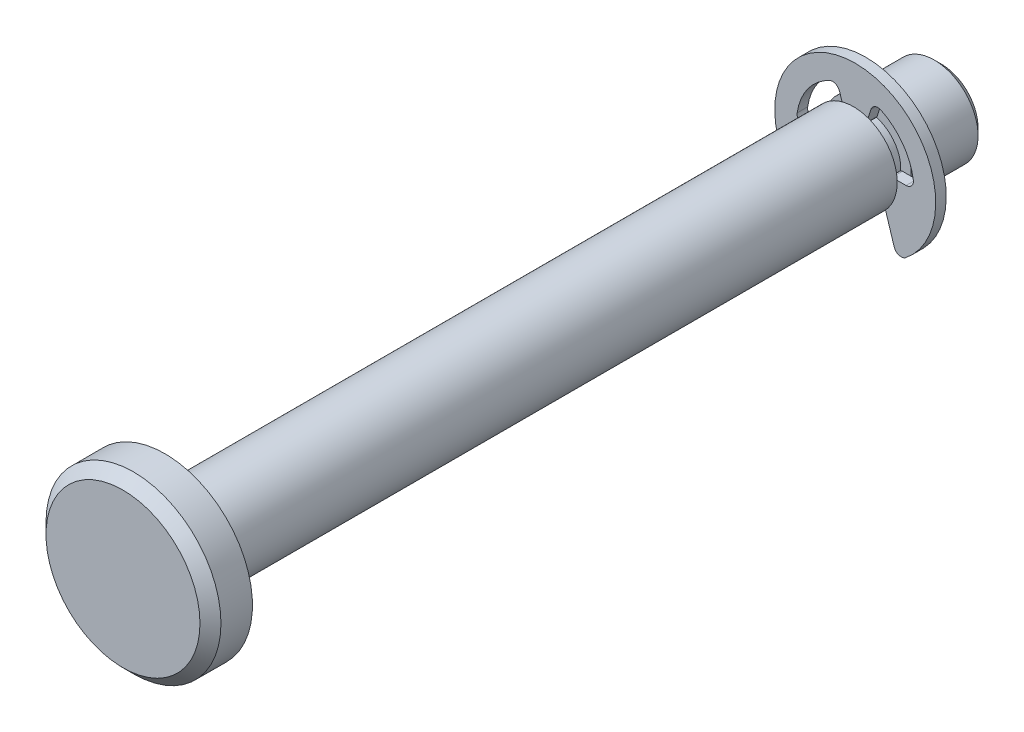
ISO-10303-21;
HEADER;
FILE_DESCRIPTION(('STEP AP214'),'2;1');
FILE_NAME('part.step','',(''),(''),'','','');
FILE_SCHEMA(('AUTOMOTIVE_DESIGN { 1 0 10303 214 1 1 1 1 }'));
ENDSEC;
DATA;
#1=APPLICATION_CONTEXT('core data for automotive mechanical design processes');
#2=APPLICATION_PROTOCOL_DEFINITION('international standard','automotive_design',2000,#1);
#3=PRODUCT_CONTEXT('',#1,'mechanical');
#4=PRODUCT('Part','Part','',(#3));
#5=PRODUCT_RELATED_PRODUCT_CATEGORY('part','',(#4));
#6=PRODUCT_DEFINITION_FORMATION('','',#4);
#7=PRODUCT_DEFINITION_CONTEXT('part definition',#1,'design');
#8=PRODUCT_DEFINITION('design','',#6,#7);
#9=PRODUCT_DEFINITION_SHAPE('','',#8);
#10=(LENGTH_UNIT() NAMED_UNIT(*) SI_UNIT(.MILLI.,.METRE.));
#11=(NAMED_UNIT(*) PLANE_ANGLE_UNIT() SI_UNIT($,.RADIAN.));
#12=(NAMED_UNIT(*) SI_UNIT($,.STERADIAN.) SOLID_ANGLE_UNIT());
#13=UNCERTAINTY_MEASURE_WITH_UNIT(LENGTH_MEASURE(1.E-05),#10,'distance_accuracy_value','');
#14=(GEOMETRIC_REPRESENTATION_CONTEXT(3) GLOBAL_UNCERTAINTY_ASSIGNED_CONTEXT((#13)) GLOBAL_UNIT_ASSIGNED_CONTEXT((#10,
#11,#12)) REPRESENTATION_CONTEXT('',''));
#15=CARTESIAN_POINT('',(0.,0.,0.));
#16=DIRECTION('',(0.,0.,1.));
#17=DIRECTION('',(1.,0.,0.));
#18=AXIS2_PLACEMENT_3D('',#15,#16,#17);
#19=CARTESIAN_POINT('',(1.11230004178683,-0.746985033010048,-13.8496));
#20=DIRECTION('',(0.,0.,1.));
#21=DIRECTION('',(1.,0.,0.));
#22=AXIS2_PLACEMENT_3D('',#19,#20,#21);
#23=CYLINDRICAL_SURFACE('',#22,0.13335);
#24=CARTESIAN_POINT('',(1.11230004178683,-0.746985033010048,-11.1064));
#25=DIRECTION('',(0.,0.,-1.));
#26=DIRECTION('',(0.,1.,0.));
#27=AXIS2_PLACEMENT_3D('',#24,#25,#26);
#28=CIRCLE('',#27,0.13335);
#29=CARTESIAN_POINT('',(0.98512188640455,-0.787084151373943,-11.1064));
#30=VERTEX_POINT('',#29);
#31=CARTESIAN_POINT('',(1.00159719402605,-0.672640551051702,-11.1064));
#32=VERTEX_POINT('',#31);
#33=EDGE_CURVE('P0_E463',#30,#32,#28,.T.);
#34=ORIENTED_EDGE('',*,*,#33,.F.);
#35=DIRECTION('',(0.,0.,-1.));
#36=VECTOR('',#35,1.);
#37=CARTESIAN_POINT('',(0.98512188640455,-0.787084151373942,-13.8496));
#38=LINE('',#37,#36);
#39=CARTESIAN_POINT('',(0.98512188640455,-0.787084151373942,-10.7254));
#40=VERTEX_POINT('',#39);
#41=EDGE_CURVE('P0_E25',#40,#30,#38,.T.);
#42=ORIENTED_EDGE('',*,*,#41,.F.);
#43=CARTESIAN_POINT('',(1.11230004178683,-0.746985033010048,-10.7254));
#44=DIRECTION('',(0.,0.,1.));
#45=DIRECTION('',(0.,-1.,0.));
#46=AXIS2_PLACEMENT_3D('',#43,#44,#45);
#47=CIRCLE('',#46,0.13335);
#48=CARTESIAN_POINT('',(1.00159719402605,-0.672640551051702,-10.7254));
#49=VERTEX_POINT('',#48);
#50=EDGE_CURVE('P0_E373',#49,#40,#47,.T.);
#51=ORIENTED_EDGE('',*,*,#50,.F.);
#52=DIRECTION('',(0.,0.,1.));
#53=VECTOR('',#52,1.);
#54=CARTESIAN_POINT('',(1.00159719402605,-0.672640551051702,-13.8496));
#55=LINE('',#54,#53);
#56=EDGE_CURVE('P0_E422',#32,#49,#55,.T.);
#57=ORIENTED_EDGE('',*,*,#56,.F.);
#58=EDGE_LOOP('',(#34,#42,#51,#57));
#59=FACE_BOUND('',#58,.T.);
#60=ADVANCED_FACE('P0_F17',(#59),#23,.T.);
#61=CARTESIAN_POINT('',(1.33319758475629,-0.133349999999999,-13.8496));
#62=DIRECTION('',(0.,0.,1.));
#63=DIRECTION('',(1.,0.,0.));
#64=AXIS2_PLACEMENT_3D('',#61,#62,#63);
#65=CYLINDRICAL_SURFACE('',#64,0.13335);
#66=CARTESIAN_POINT('',(1.33319758475629,-0.133349999999999,-11.1064));
#67=DIRECTION('',(0.,0.,-1.));
#68=DIRECTION('',(0.,1.,0.));
#69=AXIS2_PLACEMENT_3D('',#66,#67,#68);
#70=CIRCLE('',#69,0.13335);
#71=CARTESIAN_POINT('',(1.20050967347723,-0.120078199052131,-11.1064));
#72=VERTEX_POINT('',#71);
#73=CARTESIAN_POINT('',(1.33319758475629,0.,-11.1064));
#74=VERTEX_POINT('',#73);
#75=EDGE_CURVE('P0_E462',#72,#74,#70,.T.);
#76=ORIENTED_EDGE('',*,*,#75,.F.);
#77=DIRECTION('',(0.,0.,-1.));
#78=VECTOR('',#77,1.);
#79=CARTESIAN_POINT('',(1.20050967347723,-0.120078199052131,-13.8496));
#80=LINE('',#79,#78);
#81=CARTESIAN_POINT('',(1.20050967347723,-0.120078199052131,-10.7254));
#82=VERTEX_POINT('',#81);
#83=EDGE_CURVE('P0_E420',#82,#72,#80,.T.);
#84=ORIENTED_EDGE('',*,*,#83,.F.);
#85=CARTESIAN_POINT('',(1.33319758475629,-0.133349999999999,-10.7254));
#86=DIRECTION('',(0.,0.,1.));
#87=DIRECTION('',(0.,-1.,0.));
#88=AXIS2_PLACEMENT_3D('',#85,#86,#87);
#89=CIRCLE('',#88,0.13335);
#90=CARTESIAN_POINT('',(1.33319758475629,0.,-10.7254));
#91=VERTEX_POINT('',#90);
#92=EDGE_CURVE('P0_E365',#91,#82,#89,.T.);
#93=ORIENTED_EDGE('',*,*,#92,.F.);
#94=DIRECTION('',(0.,0.,1.));
#95=VECTOR('',#94,1.);
#96=CARTESIAN_POINT('',(1.33319758475629,0.,-13.8496));
#97=LINE('',#96,#95);
#98=EDGE_CURVE('P0_E368',#74,#91,#97,.T.);
#99=ORIENTED_EDGE('',*,*,#98,.F.);
#100=EDGE_LOOP('',(#76,#84,#93,#99));
#101=FACE_BOUND('',#100,.T.);
#102=ADVANCED_FACE('P0_F491',(#101),#65,.T.);
#103=CARTESIAN_POINT('',(0.285157324101359,1.30915366669133,-13.8496));
#104=DIRECTION('',(0.,0.,1.));
#105=DIRECTION('',(1.,0.,0.));
#106=AXIS2_PLACEMENT_3D('',#103,#104,#105);
#107=CYLINDRICAL_SURFACE('',#106,0.13335);
#108=CARTESIAN_POINT('',(0.285157324101359,1.30915366669133,-11.1064));
#109=DIRECTION('',(0.,0.,-1.));
#110=DIRECTION('',(0.,1.,0.));
#111=AXIS2_PLACEMENT_3D('',#108,#109,#110);
#112=CIRCLE('',#111,0.13335);
#113=CARTESIAN_POINT('',(0.411980710549319,1.26794625049143,-11.1064));
#114=VERTEX_POINT('',#113);
#115=CARTESIAN_POINT('',(0.256776737342456,1.17885875199693,-11.1064));
#116=VERTEX_POINT('',#115);
#117=EDGE_CURVE('P0_E270',#114,#116,#112,.T.);
#118=ORIENTED_EDGE('',*,*,#117,.F.);
#119=DIRECTION('',(0.,0.,-1.));
#120=VECTOR('',#119,1.);
#121=CARTESIAN_POINT('',(0.411980710549319,1.26794625049143,-13.8496));
#122=LINE('',#121,#120);
#123=CARTESIAN_POINT('',(0.411980710549319,1.26794625049143,-10.7254));
#124=VERTEX_POINT('',#123);
#125=EDGE_CURVE('P0_E378',#124,#114,#122,.T.);
#126=ORIENTED_EDGE('',*,*,#125,.F.);
#127=CARTESIAN_POINT('',(0.285157324101359,1.30915366669133,-10.7254));
#128=DIRECTION('',(0.,0.,1.));
#129=DIRECTION('',(0.,-1.,0.));
#130=AXIS2_PLACEMENT_3D('',#127,#128,#129);
#131=CIRCLE('',#130,0.13335);
#132=CARTESIAN_POINT('',(0.256776737342456,1.17885875199693,-10.7254));
#133=VERTEX_POINT('',#132);
#134=EDGE_CURVE('P0_E338',#133,#124,#131,.T.);
#135=ORIENTED_EDGE('',*,*,#134,.F.);
#136=DIRECTION('',(0.,0.,1.));
#137=VECTOR('',#136,1.);
#138=CARTESIAN_POINT('',(0.256776737342456,1.17885875199693,-13.8496));
#139=LINE('',#138,#137);
#140=EDGE_CURVE('P0_E381',#116,#133,#139,.T.);
#141=ORIENTED_EDGE('',*,*,#140,.F.);
#142=EDGE_LOOP('',(#118,#126,#135,#141));
#143=FACE_BOUND('',#142,.T.);
#144=ADVANCED_FACE('P0_F557',(#143),#107,.T.);
#145=CARTESIAN_POINT('',(-0.28515732410136,1.30915366669133,-13.8496));
#146=DIRECTION('',(0.,0.,1.));
#147=DIRECTION('',(1.,0.,0.));
#148=AXIS2_PLACEMENT_3D('',#145,#146,#147);
#149=CYLINDRICAL_SURFACE('',#148,0.13335);
#150=CARTESIAN_POINT('',(-0.28515732410136,1.30915366669133,-11.1064));
#151=DIRECTION('',(0.,0.,-1.));
#152=DIRECTION('',(0.,1.,0.));
#153=AXIS2_PLACEMENT_3D('',#150,#151,#152);
#154=CIRCLE('',#153,0.13335);
#155=CARTESIAN_POINT('',(-0.256776737342457,1.17885875199693,-11.1064));
#156=VERTEX_POINT('',#155);
#157=CARTESIAN_POINT('',(-0.411980710549319,1.26794625049143,-11.1064));
#158=VERTEX_POINT('',#157);
#159=EDGE_CURVE('P0_E239',#156,#158,#154,.T.);
#160=ORIENTED_EDGE('',*,*,#159,.F.);
#161=DIRECTION('',(0.,0.,-1.));
#162=VECTOR('',#161,1.);
#163=CARTESIAN_POINT('',(-0.256776737342457,1.17885875199693,-13.8496));
#164=LINE('',#163,#162);
#165=CARTESIAN_POINT('',(-0.256776737342457,1.17885875199693,-10.7254));
#166=VERTEX_POINT('',#165);
#167=EDGE_CURVE('P0_E396',#166,#156,#164,.T.);
#168=ORIENTED_EDGE('',*,*,#167,.F.);
#169=CARTESIAN_POINT('',(-0.28515732410136,1.30915366669133,-10.7254));
#170=DIRECTION('',(0.,0.,1.));
#171=DIRECTION('',(0.,-1.,0.));
#172=AXIS2_PLACEMENT_3D('',#169,#170,#171);
#173=CIRCLE('',#172,0.13335);
#174=CARTESIAN_POINT('',(-0.411980710549319,1.26794625049143,-10.7254));
#175=VERTEX_POINT('',#174);
#176=EDGE_CURVE('P0_E242',#175,#166,#173,.T.);
#177=ORIENTED_EDGE('',*,*,#176,.F.);
#178=DIRECTION('',(0.,0.,1.));
#179=VECTOR('',#178,1.);
#180=CARTESIAN_POINT('',(-0.411980710549319,1.26794625049143,-10.7254));
#181=LINE('',#180,#179);
#182=EDGE_CURVE('P0_E235',#158,#175,#181,.T.);
#183=ORIENTED_EDGE('',*,*,#182,.F.);
#184=EDGE_LOOP('',(#160,#168,#177,#183));
#185=FACE_BOUND('',#184,.T.);
#186=ADVANCED_FACE('P0_F237',(#185),#149,.T.);
#187=CARTESIAN_POINT('',(-1.33319758475629,-0.13335,-13.8496));
#188=DIRECTION('',(0.,0.,1.));
#189=DIRECTION('',(1.,0.,0.));
#190=AXIS2_PLACEMENT_3D('',#187,#188,#189);
#191=CYLINDRICAL_SURFACE('',#190,0.13335);
#192=CARTESIAN_POINT('',(-1.33319758475629,-0.13335,-11.1064));
#193=DIRECTION('',(0.,0.,-1.));
#194=DIRECTION('',(0.,1.,0.));
#195=AXIS2_PLACEMENT_3D('',#192,#193,#194);
#196=CIRCLE('',#195,0.13335);
#197=CARTESIAN_POINT('',(-1.33319758475629,0.,-11.1064));
#198=VERTEX_POINT('',#197);
#199=CARTESIAN_POINT('',(-1.20050967347722,-0.120078199052132,-11.1064));
#200=VERTEX_POINT('',#199);
#201=EDGE_CURVE('P0_E299',#198,#200,#196,.T.);
#202=ORIENTED_EDGE('',*,*,#201,.F.);
#203=DIRECTION('',(0.,0.,-1.));
#204=VECTOR('',#203,1.);
#205=CARTESIAN_POINT('',(-1.33319758475629,0.,-11.1064));
#206=LINE('',#205,#204);
#207=CARTESIAN_POINT('',(-1.33319758475629,0.,-10.7254));
#208=VERTEX_POINT('',#207);
#209=EDGE_CURVE('P0_E283',#208,#198,#206,.T.);
#210=ORIENTED_EDGE('',*,*,#209,.F.);
#211=CARTESIAN_POINT('',(-1.33319758475629,-0.13335,-10.7254));
#212=DIRECTION('',(0.,0.,1.));
#213=DIRECTION('',(0.,-1.,0.));
#214=AXIS2_PLACEMENT_3D('',#211,#212,#213);
#215=CIRCLE('',#214,0.13335);
#216=CARTESIAN_POINT('',(-1.20050967347722,-0.120078199052132,-10.7254));
#217=VERTEX_POINT('',#216);
#218=EDGE_CURVE('P0_E315',#217,#208,#215,.T.);
#219=ORIENTED_EDGE('',*,*,#218,.F.);
#220=DIRECTION('',(0.,0.,1.));
#221=VECTOR('',#220,1.);
#222=CARTESIAN_POINT('',(-1.20050967347723,-0.120078199052132,-13.8496));
#223=LINE('',#222,#221);
#224=EDGE_CURVE('P0_E280',#200,#217,#223,.T.);
#225=ORIENTED_EDGE('',*,*,#224,.F.);
#226=EDGE_LOOP('',(#202,#210,#219,#225));
#227=FACE_BOUND('',#226,.T.);
#228=ADVANCED_FACE('P0_F753',(#227),#191,.T.);
#229=CARTESIAN_POINT('',(-1.11230004178683,-0.746985033010048,-13.8496));
#230=DIRECTION('',(0.,0.,1.));
#231=DIRECTION('',(1.,0.,0.));
#232=AXIS2_PLACEMENT_3D('',#229,#230,#231);
#233=CYLINDRICAL_SURFACE('',#232,0.13335);
#234=CARTESIAN_POINT('',(-1.11230004178683,-0.746985033010048,-11.1064));
#235=DIRECTION('',(0.,0.,-1.));
#236=DIRECTION('',(0.,1.,0.));
#237=AXIS2_PLACEMENT_3D('',#234,#235,#236);
#238=CIRCLE('',#237,0.13335);
#239=CARTESIAN_POINT('',(-1.00159719402605,-0.672640551051702,-11.1064));
#240=VERTEX_POINT('',#239);
#241=CARTESIAN_POINT('',(-0.985121886404549,-0.787084151373942,-11.1064));
#242=VERTEX_POINT('',#241);
#243=EDGE_CURVE('P0_E504',#240,#242,#238,.T.);
#244=ORIENTED_EDGE('',*,*,#243,.F.);
#245=DIRECTION('',(0.,0.,-1.));
#246=VECTOR('',#245,1.);
#247=CARTESIAN_POINT('',(-1.00159719402605,-0.672640551051702,-13.8496));
#248=LINE('',#247,#246);
#249=CARTESIAN_POINT('',(-1.00159719402605,-0.672640551051702,-10.7254));
#250=VERTEX_POINT('',#249);
#251=EDGE_CURVE('P0_E284',#250,#240,#248,.T.);
#252=ORIENTED_EDGE('',*,*,#251,.F.);
#253=CARTESIAN_POINT('',(-1.11230004178683,-0.746985033010048,-10.7254));
#254=DIRECTION('',(0.,0.,1.));
#255=DIRECTION('',(0.,-1.,0.));
#256=AXIS2_PLACEMENT_3D('',#253,#254,#255);
#257=CIRCLE('',#256,0.13335);
#258=CARTESIAN_POINT('',(-0.98512188640455,-0.787084151373942,-10.7254));
#259=VERTEX_POINT('',#258);
#260=EDGE_CURVE('P0_E307',#259,#250,#257,.T.);
#261=ORIENTED_EDGE('',*,*,#260,.F.);
#262=DIRECTION('',(0.,0.,1.));
#263=VECTOR('',#262,1.);
#264=CARTESIAN_POINT('',(-0.98512188640455,-0.787084151373942,-10.7254));
#265=LINE('',#264,#263);
#266=EDGE_CURVE('P0_E360',#242,#259,#265,.T.);
#267=ORIENTED_EDGE('',*,*,#266,.F.);
#268=EDGE_LOOP('',(#244,#252,#261,#267));
#269=FACE_BOUND('',#268,.T.);
#270=ADVANCED_FACE('P0_F757',(#269),#233,.T.);
#271=CARTESIAN_POINT('',(-1.6676834617893,-2.06497950626016,-11.1064));
#272=DIRECTION('',(0.,0.,-1.));
#273=DIRECTION('',(0.,1.,0.));
#274=AXIS2_PLACEMENT_3D('',#271,#272,#273);
#275=CYLINDRICAL_SURFACE('',#274,0.2667);
#276=CARTESIAN_POINT('',(-1.6676834617893,-2.06497950626016,-11.1064));
#277=DIRECTION('',(0.,0.,-1.));
#278=DIRECTION('',(0.,1.,0.));
#279=AXIS2_PLACEMENT_3D('',#276,#277,#278);
#280=CIRCLE('',#279,0.2667);
#281=CARTESIAN_POINT('',(-1.41332715102474,-2.14517774298795,-11.1064));
#282=VERTEX_POINT('',#281);
#283=CARTESIAN_POINT('',(-1.83524974263894,-2.27246548535808,-11.1064));
#284=VERTEX_POINT('',#283);
#285=EDGE_CURVE('P0_E514',#282,#284,#280,.T.);
#286=ORIENTED_EDGE('',*,*,#285,.F.);
#287=DIRECTION('',(0.,0.,-1.));
#288=VECTOR('',#287,1.);
#289=CARTESIAN_POINT('',(-1.41332715102474,-2.14517774298795,-13.8496));
#290=LINE('',#289,#288);
#291=CARTESIAN_POINT('',(-1.41332715102474,-2.14517774298795,-10.7254));
#292=VERTEX_POINT('',#291);
#293=EDGE_CURVE('P0_E357',#292,#282,#290,.T.);
#294=ORIENTED_EDGE('',*,*,#293,.F.);
#295=CARTESIAN_POINT('',(-1.6676834617893,-2.06497950626016,-10.7254));
#296=DIRECTION('',(0.,0.,1.));
#297=DIRECTION('',(0.,-1.,0.));
#298=AXIS2_PLACEMENT_3D('',#295,#296,#297);
#299=CIRCLE('',#298,0.2667);
#300=CARTESIAN_POINT('',(-1.83524974263894,-2.27246548535808,-10.7254));
#301=VERTEX_POINT('',#300);
#302=EDGE_CURVE('P0_E395',#301,#292,#299,.T.);
#303=ORIENTED_EDGE('',*,*,#302,.F.);
#304=DIRECTION('',(0.,0.,1.));
#305=VECTOR('',#304,1.);
#306=CARTESIAN_POINT('',(-1.83524974263894,-2.27246548535808,-11.1064));
#307=LINE('',#306,#305);
#308=EDGE_CURVE('P0_E38',#284,#301,#307,.T.);
#309=ORIENTED_EDGE('',*,*,#308,.F.);
#310=EDGE_LOOP('',(#286,#294,#303,#309));
#311=FACE_BOUND('',#310,.T.);
#312=ADVANCED_FACE('P0_F894',(#311),#275,.T.);
#313=CARTESIAN_POINT('',(-1.84444035769405,0.2667,-13.8496));
#314=DIRECTION('',(0.,0.,1.));
#315=DIRECTION('',(1.,0.,0.));
#316=AXIS2_PLACEMENT_3D('',#313,#314,#315);
#317=CYLINDRICAL_SURFACE('',#316,0.2667);
#318=CARTESIAN_POINT('',(-1.84444035769405,0.2667,-11.1064));
#319=DIRECTION('',(0.,0.,1.));
#320=DIRECTION('',(0.,1.,0.));
#321=AXIS2_PLACEMENT_3D('',#318,#319,#320);
#322=CIRCLE('',#321,0.2667);
#323=CARTESIAN_POINT('',(-2.10839522092966,0.304867003737086,-11.1064));
#324=VERTEX_POINT('',#323);
#325=CARTESIAN_POINT('',(-1.84444035769405,0.,-11.1064));
#326=VERTEX_POINT('',#325);
#327=EDGE_CURVE('P0_E274',#324,#326,#322,.T.);
#328=ORIENTED_EDGE('',*,*,#327,.F.);
#329=DIRECTION('',(0.,0.,-1.));
#330=VECTOR('',#329,1.);
#331=CARTESIAN_POINT('',(-2.10839522092966,0.304867003737085,-13.8496));
#332=LINE('',#331,#330);
#333=CARTESIAN_POINT('',(-2.10839522092966,0.304867003737086,-10.7254));
#334=VERTEX_POINT('',#333);
#335=EDGE_CURVE('P0_E248',#334,#324,#332,.T.);
#336=ORIENTED_EDGE('',*,*,#335,.F.);
#337=CARTESIAN_POINT('',(-1.84444035769405,0.2667,-10.7254));
#338=DIRECTION('',(0.,0.,-1.));
#339=DIRECTION('',(0.,-1.,0.));
#340=AXIS2_PLACEMENT_3D('',#337,#338,#339);
#341=CIRCLE('',#340,0.2667);
#342=CARTESIAN_POINT('',(-1.84444035769405,0.,-10.7254));
#343=VERTEX_POINT('',#342);
#344=EDGE_CURVE('P0_E295',#343,#334,#341,.T.);
#345=ORIENTED_EDGE('',*,*,#344,.F.);
#346=DIRECTION('',(0.,0.,1.));
#347=VECTOR('',#346,1.);
#348=CARTESIAN_POINT('',(-1.84444035769405,0.,-13.8496));
#349=LINE('',#348,#347);
#350=EDGE_CURVE('P0_E388',#326,#343,#349,.T.);
#351=ORIENTED_EDGE('',*,*,#350,.F.);
#352=EDGE_LOOP('',(#328,#336,#345,#351));
#353=FACE_BOUND('',#352,.T.);
#354=ADVANCED_FACE('P0_F885',(#353),#317,.F.);
#355=CARTESIAN_POINT('',(-0.823610188534374,1.67175218870289,-13.8496));
#356=DIRECTION('',(0.,0.,1.));
#357=DIRECTION('',(1.,0.,0.));
#358=AXIS2_PLACEMENT_3D('',#355,#356,#357);
#359=CYLINDRICAL_SURFACE('',#358,0.2667);
#360=CARTESIAN_POINT('',(-0.823610188534374,1.67175218870289,-11.1064));
#361=DIRECTION('',(0.,0.,1.));
#362=DIRECTION('',(0.,1.,0.));
#363=AXIS2_PLACEMENT_3D('',#360,#361,#362);
#364=CIRCLE('',#363,0.2667);
#365=CARTESIAN_POINT('',(-0.569963415638455,1.75416702110268,-11.1064));
#366=VERTEX_POINT('',#365);
#367=CARTESIAN_POINT('',(-0.941475704633709,1.91099392861179,-11.1064));
#368=VERTEX_POINT('',#367);
#369=EDGE_CURVE('P0_E257',#366,#368,#364,.T.);
#370=ORIENTED_EDGE('',*,*,#369,.F.);
#371=DIRECTION('',(0.,0.,-1.));
#372=VECTOR('',#371,1.);
#373=CARTESIAN_POINT('',(-0.569963415638456,1.75416702110268,-13.8496));
#374=LINE('',#373,#372);
#375=CARTESIAN_POINT('',(-0.569963415638456,1.75416702110269,-10.7254));
#376=VERTEX_POINT('',#375);
#377=EDGE_CURVE('P0_E247',#376,#366,#374,.T.);
#378=ORIENTED_EDGE('',*,*,#377,.F.);
#379=CARTESIAN_POINT('',(-0.823610188534374,1.67175218870289,-10.7254));
#380=DIRECTION('',(0.,0.,-1.));
#381=DIRECTION('',(0.,-1.,0.));
#382=AXIS2_PLACEMENT_3D('',#379,#380,#381);
#383=CIRCLE('',#382,0.2667);
#384=CARTESIAN_POINT('',(-0.941475704633709,1.91099392861179,-10.7254));
#385=VERTEX_POINT('',#384);
#386=EDGE_CURVE('P0_E294',#385,#376,#383,.T.);
#387=ORIENTED_EDGE('',*,*,#386,.F.);
#388=DIRECTION('',(0.,0.,1.));
#389=VECTOR('',#388,1.);
#390=CARTESIAN_POINT('',(-0.941475704633709,1.91099392861179,-13.8496));
#391=LINE('',#390,#389);
#392=EDGE_CURVE('P0_E408',#368,#385,#391,.T.);
#393=ORIENTED_EDGE('',*,*,#392,.F.);
#394=EDGE_LOOP('',(#370,#378,#387,#393));
#395=FACE_BOUND('',#394,.T.);
#396=ADVANCED_FACE('P0_F876',(#395),#359,.F.);
#397=CARTESIAN_POINT('',(0.823610188534373,1.67175218870289,-13.8496));
#398=DIRECTION('',(0.,0.,1.));
#399=DIRECTION('',(1.,0.,0.));
#400=AXIS2_PLACEMENT_3D('',#397,#398,#399);
#401=CYLINDRICAL_SURFACE('',#400,0.2667);
#402=CARTESIAN_POINT('',(0.823610188534373,1.67175218870289,-11.1064));
#403=DIRECTION('',(0.,0.,1.));
#404=DIRECTION('',(0.,1.,0.));
#405=AXIS2_PLACEMENT_3D('',#402,#403,#404);
#406=CIRCLE('',#405,0.2667);
#407=CARTESIAN_POINT('',(0.941475704633708,1.91099392861179,-11.1064));
#408=VERTEX_POINT('',#407);
#409=CARTESIAN_POINT('',(0.569963415638455,1.75416702110268,-11.1064));
#410=VERTEX_POINT('',#409);
#411=EDGE_CURVE('P0_E450',#408,#410,#406,.T.);
#412=ORIENTED_EDGE('',*,*,#411,.F.);
#413=DIRECTION('',(0.,0.,-1.));
#414=VECTOR('',#413,1.);
#415=CARTESIAN_POINT('',(0.941475704633708,1.91099392861179,-13.8496));
#416=LINE('',#415,#414);
#417=CARTESIAN_POINT('',(0.941475704633708,1.91099392861179,-10.7254));
#418=VERTEX_POINT('',#417);
#419=EDGE_CURVE('P0_E342',#418,#408,#416,.T.);
#420=ORIENTED_EDGE('',*,*,#419,.F.);
#421=CARTESIAN_POINT('',(0.823610188534373,1.67175218870289,-10.7254));
#422=DIRECTION('',(0.,0.,-1.));
#423=DIRECTION('',(0.,-1.,0.));
#424=AXIS2_PLACEMENT_3D('',#421,#422,#423);
#425=CIRCLE('',#424,0.2667);
#426=CARTESIAN_POINT('',(0.569963415638455,1.75416702110269,-10.7254));
#427=VERTEX_POINT('',#426);
#428=EDGE_CURVE('P0_E348',#427,#418,#425,.T.);
#429=ORIENTED_EDGE('',*,*,#428,.F.);
#430=DIRECTION('',(0.,0.,1.));
#431=VECTOR('',#430,1.);
#432=CARTESIAN_POINT('',(0.569963415638455,1.75416702110268,-13.8496));
#433=LINE('',#432,#431);
#434=EDGE_CURVE('P0_E343',#410,#427,#433,.T.);
#435=ORIENTED_EDGE('',*,*,#434,.F.);
#436=EDGE_LOOP('',(#412,#420,#429,#435));
#437=FACE_BOUND('',#436,.T.);
#438=ADVANCED_FACE('P0_F869',(#437),#401,.F.);
#439=CARTESIAN_POINT('',(1.84444035769405,0.2667,-13.8496));
#440=DIRECTION('',(0.,0.,1.));
#441=DIRECTION('',(1.,0.,0.));
#442=AXIS2_PLACEMENT_3D('',#439,#440,#441);
#443=CYLINDRICAL_SURFACE('',#442,0.2667);
#444=CARTESIAN_POINT('',(1.84444035769405,0.2667,-11.1064));
#445=DIRECTION('',(0.,0.,1.));
#446=DIRECTION('',(0.,1.,0.));
#447=AXIS2_PLACEMENT_3D('',#444,#445,#446);
#448=CIRCLE('',#447,0.2667);
#449=CARTESIAN_POINT('',(1.84444035769405,0.,-11.1064));
#450=VERTEX_POINT('',#449);
#451=CARTESIAN_POINT('',(2.10839522092966,0.304867003737086,-11.1064));
#452=VERTEX_POINT('',#451);
#453=EDGE_CURVE('P0_E451',#450,#452,#448,.T.);
#454=ORIENTED_EDGE('',*,*,#453,.F.);
#455=DIRECTION('',(0.,0.,-1.));
#456=VECTOR('',#455,1.);
#457=CARTESIAN_POINT('',(1.84444035769405,0.,-13.8496));
#458=LINE('',#457,#456);
#459=CARTESIAN_POINT('',(1.84444035769405,0.,-10.7254));
#460=VERTEX_POINT('',#459);
#461=EDGE_CURVE('P0_E419',#460,#450,#458,.T.);
#462=ORIENTED_EDGE('',*,*,#461,.F.);
#463=CARTESIAN_POINT('',(1.84444035769405,0.2667,-10.7254));
#464=DIRECTION('',(0.,0.,-1.));
#465=DIRECTION('',(0.,-1.,0.));
#466=AXIS2_PLACEMENT_3D('',#463,#464,#465);
#467=CIRCLE('',#466,0.2667);
#468=CARTESIAN_POINT('',(2.10839522092966,0.304867003737086,-10.7254));
#469=VERTEX_POINT('',#468);
#470=EDGE_CURVE('P0_E356',#469,#460,#467,.T.);
#471=ORIENTED_EDGE('',*,*,#470,.F.);
#472=DIRECTION('',(0.,0.,1.));
#473=VECTOR('',#472,1.);
#474=CARTESIAN_POINT('',(2.10839522092966,0.304867003737086,-13.8496));
#475=LINE('',#474,#473);
#476=EDGE_CURVE('P0_E339',#452,#469,#475,.T.);
#477=ORIENTED_EDGE('',*,*,#476,.F.);
#478=EDGE_LOOP('',(#454,#462,#471,#477));
#479=FACE_BOUND('',#478,.T.);
#480=ADVANCED_FACE('P0_F480',(#479),#443,.F.);
#481=CARTESIAN_POINT('',(1.6676834617893,-2.06497950626016,-11.1064));
#482=DIRECTION('',(0.,0.,-1.));
#483=DIRECTION('',(0.,1.,0.));
#484=AXIS2_PLACEMENT_3D('',#481,#482,#483);
#485=CYLINDRICAL_SURFACE('',#484,0.2667);
#486=CARTESIAN_POINT('',(1.6676834617893,-2.06497950626016,-11.1064));
#487=DIRECTION('',(0.,0.,-1.));
#488=DIRECTION('',(0.,1.,0.));
#489=AXIS2_PLACEMENT_3D('',#486,#487,#488);
#490=CIRCLE('',#489,0.2667);
#491=CARTESIAN_POINT('',(1.83524974263894,-2.27246548535807,-11.1064));
#492=VERTEX_POINT('',#491);
#493=CARTESIAN_POINT('',(1.41332715102475,-2.14517774298795,-11.1064));
#494=VERTEX_POINT('',#493);
#495=EDGE_CURVE('P0_E439',#492,#494,#490,.T.);
#496=ORIENTED_EDGE('',*,*,#495,.F.);
#497=DIRECTION('',(0.,0.,-1.));
#498=VECTOR('',#497,1.);
#499=CARTESIAN_POINT('',(1.83524974263894,-2.27246548535807,-11.1064));
#500=LINE('',#499,#498);
#501=CARTESIAN_POINT('',(1.83524974263894,-2.27246548535807,-10.7254));
#502=VERTEX_POINT('',#501);
#503=EDGE_CURVE('P0_E49',#502,#492,#500,.T.);
#504=ORIENTED_EDGE('',*,*,#503,.F.);
#505=CARTESIAN_POINT('',(1.6676834617893,-2.06497950626016,-10.7254));
#506=DIRECTION('',(0.,0.,1.));
#507=DIRECTION('',(0.,-1.,0.));
#508=AXIS2_PLACEMENT_3D('',#505,#506,#507);
#509=CIRCLE('',#508,0.2667);
#510=CARTESIAN_POINT('',(1.41332715102475,-2.14517774298795,-10.7254));
#511=VERTEX_POINT('',#510);
#512=EDGE_CURVE('P0_E385',#511,#502,#509,.T.);
#513=ORIENTED_EDGE('',*,*,#512,.F.);
#514=DIRECTION('',(0.,0.,1.));
#515=VECTOR('',#514,1.);
#516=CARTESIAN_POINT('',(1.41332715102475,-2.14517774298795,-10.7254));
#517=LINE('',#516,#515);
#518=EDGE_CURVE('P0_E11',#494,#511,#517,.T.);
#519=ORIENTED_EDGE('',*,*,#518,.F.);
#520=EDGE_LOOP('',(#496,#504,#513,#519));
#521=FACE_BOUND('',#520,.T.);
#522=ADVANCED_FACE('P0_F537',(#521),#485,.T.);
#523=CARTESIAN_POINT('',(0.670316785436614,0.211350070613413,-13.8496));
#524=DIRECTION('',(0.953716950748229,0.300705799504267,0.));
#525=DIRECTION('',(0.,0.,-1.));
#526=AXIS2_PLACEMENT_3D('',#523,#524,#525);
#527=PLANE('',#526);
#528=DIRECTION('',(-0.300705799504267,0.953716950748229,0.));
#529=VECTOR('',#528,1.);
#530=CARTESIAN_POINT('',(0.670316785436614,0.211350070613413,-10.7254));
#531=LINE('',#530,#529);
#532=EDGE_CURVE('P0_E377',#511,#40,#531,.T.);
#533=ORIENTED_EDGE('',*,*,#532,.T.);
#534=ORIENTED_EDGE('',*,*,#41,.T.);
#535=DIRECTION('',(0.300705799504267,-0.953716950748229,0.));
#536=VECTOR('',#535,1.);
#537=CARTESIAN_POINT('',(-0.167391599854074,2.8682216312975,-11.1064));
#538=LINE('',#537,#536);
#539=EDGE_CURVE('P0_E515',#30,#494,#538,.T.);
#540=ORIENTED_EDGE('',*,*,#539,.T.);
#541=ORIENTED_EDGE('',*,*,#518,.T.);
#542=EDGE_LOOP('',(#533,#534,#540,#541));
#543=FACE_BOUND('',#542,.T.);
#544=ADVANCED_FACE('P0_F538',(#543),#527,.F.);
#545=CARTESIAN_POINT('',(0.,0.,-13.8496));
#546=DIRECTION('',(0.,0.,1.));
#547=DIRECTION('',(1.,0.,0.));
#548=AXIS2_PLACEMENT_3D('',#545,#546,#547);
#549=CYLINDRICAL_SURFACE('',#548,1.2065);
#550=CARTESIAN_POINT('',(0.,0.,-10.7254));
#551=DIRECTION('',(0.,0.,1.));
#552=DIRECTION('',(1.,0.,0.));
#553=AXIS2_PLACEMENT_3D('',#550,#551,#552);
#554=CIRCLE('',#553,1.2065);
#555=EDGE_CURVE('P0_E372',#49,#82,#554,.T.);
#556=ORIENTED_EDGE('',*,*,#555,.T.);
#557=ORIENTED_EDGE('',*,*,#83,.T.);
#558=CARTESIAN_POINT('',(0.,0.,-11.1064));
#559=DIRECTION('',(0.,0.,-1.));
#560=DIRECTION('',(0.,1.,0.));
#561=AXIS2_PLACEMENT_3D('',#558,#559,#560);
#562=CIRCLE('',#561,1.2065);
#563=EDGE_CURVE('P0_E459',#72,#32,#562,.T.);
#564=ORIENTED_EDGE('',*,*,#563,.T.);
#565=ORIENTED_EDGE('',*,*,#56,.T.);
#566=EDGE_LOOP('',(#556,#557,#564,#565));
#567=FACE_BOUND('',#566,.T.);
#568=ADVANCED_FACE('P0_F540',(#567),#549,.F.);
#569=CARTESIAN_POINT('',(0.,0.,-13.8496));
#570=DIRECTION('',(0.,-1.,0.));
#571=DIRECTION('',(0.,0.,-1.));
#572=AXIS2_PLACEMENT_3D('',#569,#570,#571);
#573=PLANE('',#572);
#574=DIRECTION('',(-1.,0.,0.));
#575=VECTOR('',#574,1.);
#576=CARTESIAN_POINT('',(0.,0.,-11.1064));
#577=LINE('',#576,#575);
#578=EDGE_CURVE('P0_E456',#450,#74,#577,.T.);
#579=ORIENTED_EDGE('',*,*,#578,.T.);
#580=ORIENTED_EDGE('',*,*,#98,.T.);
#581=DIRECTION('',(1.,0.,0.));
#582=VECTOR('',#581,1.);
#583=CARTESIAN_POINT('',(0.,0.,-10.7254));
#584=LINE('',#583,#582);
#585=EDGE_CURVE('P0_E361',#91,#460,#584,.T.);
#586=ORIENTED_EDGE('',*,*,#585,.T.);
#587=ORIENTED_EDGE('',*,*,#461,.T.);
#588=EDGE_LOOP('',(#579,#580,#586,#587));
#589=FACE_BOUND('',#588,.T.);
#590=ADVANCED_FACE('P0_F487',(#589),#573,.F.);
#591=CARTESIAN_POINT('',(0.,0.,-13.8496));
#592=DIRECTION('',(0.,0.,1.));
#593=DIRECTION('',(1.,0.,0.));
#594=AXIS2_PLACEMENT_3D('',#591,#592,#593);
#595=CYLINDRICAL_SURFACE('',#594,2.13032258064516);
#596=CARTESIAN_POINT('',(0.,0.,-11.1064));
#597=DIRECTION('',(0.,0.,1.));
#598=DIRECTION('',(0.,1.,0.));
#599=AXIS2_PLACEMENT_3D('',#596,#597,#598);
#600=CIRCLE('',#599,2.13032258064516);
#601=EDGE_CURVE('P0_E455',#452,#408,#600,.T.);
#602=ORIENTED_EDGE('',*,*,#601,.F.);
#603=ORIENTED_EDGE('',*,*,#476,.T.);
#604=CARTESIAN_POINT('',(0.,0.,-10.7254));
#605=DIRECTION('',(0.,0.,-1.));
#606=DIRECTION('',(1.,0.,0.));
#607=AXIS2_PLACEMENT_3D('',#604,#605,#606);
#608=CIRCLE('',#607,2.13032258064516);
#609=EDGE_CURVE('P0_E352',#418,#469,#608,.T.);
#610=ORIENTED_EDGE('',*,*,#609,.F.);
#611=ORIENTED_EDGE('',*,*,#419,.T.);
#612=EDGE_LOOP('',(#602,#603,#610,#611));
#613=FACE_BOUND('',#612,.T.);
#614=ADVANCED_FACE('P0_F831',(#613),#595,.F.);
#615=CARTESIAN_POINT('',(0.,0.,-13.8496));
#616=DIRECTION('',(-0.951056516295155,0.309016994374942,0.));
#617=DIRECTION('',(0.,0.,1.));
#618=AXIS2_PLACEMENT_3D('',#615,#616,#617);
#619=PLANE('',#618);
#620=DIRECTION('',(-0.309016994374942,-0.951056516295155,0.));
#621=VECTOR('',#620,1.);
#622=CARTESIAN_POINT('',(0.,0.,-10.7254));
#623=LINE('',#622,#621);
#624=EDGE_CURVE('P0_E344',#427,#124,#623,.T.);
#625=ORIENTED_EDGE('',*,*,#624,.T.);
#626=ORIENTED_EDGE('',*,*,#125,.T.);
#627=DIRECTION('',(0.309016994374942,0.951056516295155,0.));
#628=VECTOR('',#627,1.);
#629=CARTESIAN_POINT('',(0.858460360973143,2.64206932028462,-11.1064));
#630=LINE('',#629,#628);
#631=EDGE_CURVE('P0_E446',#114,#410,#630,.T.);
#632=ORIENTED_EDGE('',*,*,#631,.T.);
#633=ORIENTED_EDGE('',*,*,#434,.T.);
#634=EDGE_LOOP('',(#625,#626,#632,#633));
#635=FACE_BOUND('',#634,.T.);
#636=ADVANCED_FACE('P0_F799',(#635),#619,.F.);
#637=CARTESIAN_POINT('',(0.,0.,-13.8496));
#638=DIRECTION('',(0.,0.,1.));
#639=DIRECTION('',(1.,0.,0.));
#640=AXIS2_PLACEMENT_3D('',#637,#638,#639);
#641=CYLINDRICAL_SURFACE('',#640,1.2065);
#642=CARTESIAN_POINT('',(0.,0.,-10.7254));
#643=DIRECTION('',(0.,0.,1.));
#644=DIRECTION('',(1.,0.,0.));
#645=AXIS2_PLACEMENT_3D('',#642,#643,#644);
#646=CIRCLE('',#645,1.2065);
#647=EDGE_CURVE('P0_E334',#133,#166,#646,.T.);
#648=ORIENTED_EDGE('',*,*,#647,.T.);
#649=ORIENTED_EDGE('',*,*,#167,.T.);
#650=CARTESIAN_POINT('',(0.,0.,-11.1064));
#651=DIRECTION('',(0.,0.,-1.));
#652=DIRECTION('',(0.,1.,0.));
#653=AXIS2_PLACEMENT_3D('',#650,#651,#652);
#654=CIRCLE('',#653,1.2065);
#655=EDGE_CURVE('P0_E263',#156,#116,#654,.T.);
#656=ORIENTED_EDGE('',*,*,#655,.T.);
#657=ORIENTED_EDGE('',*,*,#140,.T.);
#658=EDGE_LOOP('',(#648,#649,#656,#657));
#659=FACE_BOUND('',#658,.T.);
#660=ADVANCED_FACE('P0_F795',(#659),#641,.F.);
#661=CARTESIAN_POINT('',(0.,0.,-13.8496));
#662=DIRECTION('',(-0.951056516295155,-0.309016994374943,0.));
#663=DIRECTION('',(-0.309016994374943,0.951056516295155,0.));
#664=AXIS2_PLACEMENT_3D('',#661,#662,#663);
#665=PLANE('',#664);
#666=DIRECTION('',(-0.309016994374943,0.951056516295155,0.));
#667=VECTOR('',#666,1.);
#668=CARTESIAN_POINT('',(-0.858460360973144,2.64206932028462,-11.1064));
#669=LINE('',#668,#667);
#670=EDGE_CURVE('P0_E251',#158,#366,#669,.T.);
#671=ORIENTED_EDGE('',*,*,#670,.F.);
#672=ORIENTED_EDGE('',*,*,#182,.T.);
#673=DIRECTION('',(0.309016994374943,-0.951056516295155,0.));
#674=VECTOR('',#673,1.);
#675=CARTESIAN_POINT('',(0.,0.,-10.7254));
#676=LINE('',#675,#674);
#677=EDGE_CURVE('P0_E329',#376,#175,#676,.T.);
#678=ORIENTED_EDGE('',*,*,#677,.F.);
#679=ORIENTED_EDGE('',*,*,#377,.T.);
#680=EDGE_LOOP('',(#671,#672,#678,#679));
#681=FACE_BOUND('',#680,.T.);
#682=ADVANCED_FACE('P0_F252',(#681),#665,.T.);
#683=CARTESIAN_POINT('',(0.,0.,-13.8496));
#684=DIRECTION('',(0.,0.,1.));
#685=DIRECTION('',(1.,0.,0.));
#686=AXIS2_PLACEMENT_3D('',#683,#684,#685);
#687=CYLINDRICAL_SURFACE('',#686,2.13032258064516);
#688=CARTESIAN_POINT('',(0.,0.,-11.1064));
#689=DIRECTION('',(0.,0.,-1.));
#690=DIRECTION('',(0.,1.,0.));
#691=AXIS2_PLACEMENT_3D('',#688,#689,#690);
#692=CIRCLE('',#691,2.13032258064516);
#693=EDGE_CURVE('P0_E278',#324,#368,#692,.T.);
#694=ORIENTED_EDGE('',*,*,#693,.T.);
#695=ORIENTED_EDGE('',*,*,#392,.T.);
#696=CARTESIAN_POINT('',(0.,0.,-10.7254));
#697=DIRECTION('',(0.,0.,1.));
#698=DIRECTION('',(1.,0.,0.));
#699=AXIS2_PLACEMENT_3D('',#696,#697,#698);
#700=CIRCLE('',#699,2.13032258064516);
#701=EDGE_CURVE('P0_E290',#385,#334,#700,.T.);
#702=ORIENTED_EDGE('',*,*,#701,.T.);
#703=ORIENTED_EDGE('',*,*,#335,.T.);
#704=EDGE_LOOP('',(#694,#695,#702,#703));
#705=FACE_BOUND('',#704,.T.);
#706=ADVANCED_FACE('P0_F736',(#705),#687,.F.);
#707=CARTESIAN_POINT('',(0.,0.,-13.8496));
#708=DIRECTION('',(0.,1.,0.));
#709=DIRECTION('',(1.,0.,0.));
#710=AXIS2_PLACEMENT_3D('',#707,#708,#709);
#711=PLANE('',#710);
#712=DIRECTION('',(-1.,0.,0.));
#713=VECTOR('',#712,1.);
#714=CARTESIAN_POINT('',(0.,0.,-10.7254));
#715=LINE('',#714,#713);
#716=EDGE_CURVE('P0_E319',#208,#343,#715,.T.);
#717=ORIENTED_EDGE('',*,*,#716,.F.);
#718=ORIENTED_EDGE('',*,*,#209,.T.);
#719=DIRECTION('',(1.,0.,0.));
#720=VECTOR('',#719,1.);
#721=CARTESIAN_POINT('',(0.,0.,-11.1064));
#722=LINE('',#721,#720);
#723=EDGE_CURVE('P0_E277',#326,#198,#722,.T.);
#724=ORIENTED_EDGE('',*,*,#723,.F.);
#725=ORIENTED_EDGE('',*,*,#350,.T.);
#726=EDGE_LOOP('',(#717,#718,#724,#725));
#727=FACE_BOUND('',#726,.T.);
#728=ADVANCED_FACE('P0_F740',(#727),#711,.T.);
#729=CARTESIAN_POINT('',(0.,0.,-13.8496));
#730=DIRECTION('',(0.,0.,1.));
#731=DIRECTION('',(1.,0.,0.));
#732=AXIS2_PLACEMENT_3D('',#729,#730,#731);
#733=CYLINDRICAL_SURFACE('',#732,1.2065);
#734=CARTESIAN_POINT('',(0.,0.,-10.7254));
#735=DIRECTION('',(0.,0.,1.));
#736=DIRECTION('',(1.,0.,0.));
#737=AXIS2_PLACEMENT_3D('',#734,#735,#736);
#738=CIRCLE('',#737,1.2065);
#739=EDGE_CURVE('P0_E311',#217,#250,#738,.T.);
#740=ORIENTED_EDGE('',*,*,#739,.T.);
#741=ORIENTED_EDGE('',*,*,#251,.T.);
#742=CARTESIAN_POINT('',(0.,0.,-11.1064));
#743=DIRECTION('',(0.,0.,-1.));
#744=DIRECTION('',(0.,1.,0.));
#745=AXIS2_PLACEMENT_3D('',#742,#743,#744);
#746=CIRCLE('',#745,1.2065);
#747=EDGE_CURVE('P0_E500',#240,#200,#746,.T.);
#748=ORIENTED_EDGE('',*,*,#747,.T.);
#749=ORIENTED_EDGE('',*,*,#224,.T.);
#750=EDGE_LOOP('',(#740,#741,#748,#749));
#751=FACE_BOUND('',#750,.T.);
#752=ADVANCED_FACE('P0_F778',(#751),#733,.F.);
#753=CARTESIAN_POINT('',(-0.670316785436614,0.211350070613413,-13.8496));
#754=DIRECTION('',(0.953716950748229,-0.300705799504267,0.));
#755=DIRECTION('',(0.,0.,-1.));
#756=AXIS2_PLACEMENT_3D('',#753,#754,#755);
#757=PLANE('',#756);
#758=DIRECTION('',(-0.300705799504267,-0.953716950748229,0.));
#759=VECTOR('',#758,1.);
#760=CARTESIAN_POINT('',(0.167391599854074,2.8682216312975,-11.1064));
#761=LINE('',#760,#759);
#762=EDGE_CURVE('P0_E510',#242,#282,#761,.T.);
#763=ORIENTED_EDGE('',*,*,#762,.F.);
#764=ORIENTED_EDGE('',*,*,#266,.T.);
#765=DIRECTION('',(0.300705799504267,0.953716950748229,0.));
#766=VECTOR('',#765,1.);
#767=CARTESIAN_POINT('',(-0.670316785436614,0.211350070613413,-10.7254));
#768=LINE('',#767,#766);
#769=EDGE_CURVE('P0_E302',#292,#259,#768,.T.);
#770=ORIENTED_EDGE('',*,*,#769,.F.);
#771=ORIENTED_EDGE('',*,*,#293,.T.);
#772=EDGE_LOOP('',(#763,#764,#770,#771));
#773=FACE_BOUND('',#772,.T.);
#774=ADVANCED_FACE('P0_F782',(#773),#757,.T.);
#775=CARTESIAN_POINT('',(0.,0.,-11.1064));
#776=DIRECTION('',(0.,0.,-1.));
#777=DIRECTION('',(0.,1.,0.));
#778=AXIS2_PLACEMENT_3D('',#775,#776,#777);
#779=CYLINDRICAL_SURFACE('',#778,2.921);
#780=CARTESIAN_POINT('',(0.,0.,-10.7254));
#781=DIRECTION('',(0.,0.,-1.));
#782=DIRECTION('',(0.,1.,0.));
#783=AXIS2_PLACEMENT_3D('',#780,#781,#782);
#784=CIRCLE('',#783,2.921);
#785=EDGE_CURVE('P0_E392',#301,#502,#784,.T.);
#786=ORIENTED_EDGE('',*,*,#785,.T.);
#787=ORIENTED_EDGE('',*,*,#503,.T.);
#788=CARTESIAN_POINT('',(0.,0.,-11.1064));
#789=DIRECTION('',(0.,0.,-1.));
#790=DIRECTION('',(0.,1.,0.));
#791=AXIS2_PLACEMENT_3D('',#788,#789,#790);
#792=CIRCLE('',#791,2.921);
#793=EDGE_CURVE('P0_E521',#284,#492,#792,.T.);
#794=ORIENTED_EDGE('',*,*,#793,.F.);
#795=ORIENTED_EDGE('',*,*,#308,.T.);
#796=EDGE_LOOP('',(#786,#787,#794,#795));
#797=FACE_BOUND('',#796,.T.);
#798=ADVANCED_FACE('P0_F766',(#797),#779,.T.);
#799=CARTESIAN_POINT('',(0.,2.921,-10.7254));
#800=DIRECTION('',(0.,0.,1.));
#801=DIRECTION('',(0.,-1.,0.));
#802=AXIS2_PLACEMENT_3D('',#799,#800,#801);
#803=PLANE('',#802);
#804=ORIENTED_EDGE('',*,*,#769,.T.);
#805=ORIENTED_EDGE('',*,*,#260,.T.);
#806=ORIENTED_EDGE('',*,*,#739,.F.);
#807=ORIENTED_EDGE('',*,*,#218,.T.);
#808=ORIENTED_EDGE('',*,*,#716,.T.);
#809=ORIENTED_EDGE('',*,*,#344,.T.);
#810=ORIENTED_EDGE('',*,*,#701,.F.);
#811=ORIENTED_EDGE('',*,*,#386,.T.);
#812=ORIENTED_EDGE('',*,*,#677,.T.);
#813=ORIENTED_EDGE('',*,*,#176,.T.);
#814=ORIENTED_EDGE('',*,*,#647,.F.);
#815=ORIENTED_EDGE('',*,*,#134,.T.);
#816=ORIENTED_EDGE('',*,*,#624,.F.);
#817=ORIENTED_EDGE('',*,*,#428,.T.);
#818=ORIENTED_EDGE('',*,*,#609,.T.);
#819=ORIENTED_EDGE('',*,*,#470,.T.);
#820=ORIENTED_EDGE('',*,*,#585,.F.);
#821=ORIENTED_EDGE('',*,*,#92,.T.);
#822=ORIENTED_EDGE('',*,*,#555,.F.);
#823=ORIENTED_EDGE('',*,*,#50,.T.);
#824=ORIENTED_EDGE('',*,*,#532,.F.);
#825=ORIENTED_EDGE('',*,*,#512,.T.);
#826=ORIENTED_EDGE('',*,*,#785,.F.);
#827=ORIENTED_EDGE('',*,*,#302,.T.);
#828=EDGE_LOOP('',(#804,#805,#806,#807,#808,#809,#810,#811,#812,#813,#814,#815,#816,#817,#818,
#819,#820,#821,#822,#823,#824,#825,#826,#827));
#829=FACE_BOUND('',#828,.T.);
#830=ADVANCED_FACE('P0_F476',(#829),#803,.T.);
#831=CARTESIAN_POINT('',(0.,2.921,-11.1064));
#832=DIRECTION('',(0.,0.,-1.));
#833=DIRECTION('',(-1.,0.,0.));
#834=AXIS2_PLACEMENT_3D('',#831,#832,#833);
#835=PLANE('',#834);
#836=ORIENTED_EDGE('',*,*,#747,.F.);
#837=ORIENTED_EDGE('',*,*,#243,.T.);
#838=ORIENTED_EDGE('',*,*,#762,.T.);
#839=ORIENTED_EDGE('',*,*,#285,.T.);
#840=ORIENTED_EDGE('',*,*,#793,.T.);
#841=ORIENTED_EDGE('',*,*,#495,.T.);
#842=ORIENTED_EDGE('',*,*,#539,.F.);
#843=ORIENTED_EDGE('',*,*,#33,.T.);
#844=ORIENTED_EDGE('',*,*,#563,.F.);
#845=ORIENTED_EDGE('',*,*,#75,.T.);
#846=ORIENTED_EDGE('',*,*,#578,.F.);
#847=ORIENTED_EDGE('',*,*,#453,.T.);
#848=ORIENTED_EDGE('',*,*,#601,.T.);
#849=ORIENTED_EDGE('',*,*,#411,.T.);
#850=ORIENTED_EDGE('',*,*,#631,.F.);
#851=ORIENTED_EDGE('',*,*,#117,.T.);
#852=ORIENTED_EDGE('',*,*,#655,.F.);
#853=ORIENTED_EDGE('',*,*,#159,.T.);
#854=ORIENTED_EDGE('',*,*,#670,.T.);
#855=ORIENTED_EDGE('',*,*,#369,.T.);
#856=ORIENTED_EDGE('',*,*,#693,.F.);
#857=ORIENTED_EDGE('',*,*,#327,.T.);
#858=ORIENTED_EDGE('',*,*,#723,.T.);
#859=ORIENTED_EDGE('',*,*,#201,.T.);
#860=EDGE_LOOP('',(#836,#837,#838,#839,#840,#841,#842,#843,#844,#845,#846,#847,#848,#849,#850,
#851,#852,#853,#854,#855,#856,#857,#858,#859));
#861=FACE_BOUND('',#860,.T.);
#862=ADVANCED_FACE('P0_F260',(#861),#835,.T.);
#863=CLOSED_SHELL('',(#60,#102,#144,#186,#228,#270,#312,#354,#396,#438,#480,#522,#544,#568,#590,
#614,#636,#660,#682,#706,#728,#752,#774,#798,#830,#862));
#864=MANIFOLD_SOLID_BREP('P0_B1',#863);
#865=CARTESIAN_POINT('',(0.,0.,-13.8496));
#866=DIRECTION('',(0.,0.,1.));
#867=DIRECTION('',(1.,0.,0.));
#868=AXIS2_PLACEMENT_3D('',#865,#866,#867);
#869=CONICAL_SURFACE('',#868,1.33349999999999,0.78539816339745);
#870=CARTESIAN_POINT('',(0.,0.,-13.8496));
#871=DIRECTION('',(0.,0.,-1.));
#872=DIRECTION('',(-1.,0.,0.));
#873=AXIS2_PLACEMENT_3D('',#870,#871,#872);
#874=CIRCLE('',#873,1.33349999999999);
#875=CARTESIAN_POINT('',(-1.33349999999999,0.,-13.8496));
#876=VERTEX_POINT('',#875);
#877=EDGE_CURVE('P1_E11',#876,#876,#874,.T.);
#878=ORIENTED_EDGE('',*,*,#877,.F.);
#879=EDGE_LOOP('',(#878));
#880=FACE_BOUND('',#879,.T.);
#881=CARTESIAN_POINT('',(0.,0.,-13.5956));
#882=DIRECTION('',(0.,0.,1.));
#883=DIRECTION('',(-1.,0.,0.));
#884=AXIS2_PLACEMENT_3D('',#881,#882,#883);
#885=CIRCLE('',#884,1.5875);
#886=CARTESIAN_POINT('',(-1.5875,0.,-13.5956));
#887=VERTEX_POINT('',#886);
#888=EDGE_CURVE('P1_E26',#887,#887,#885,.T.);
#889=ORIENTED_EDGE('',*,*,#888,.F.);
#890=EDGE_LOOP('',(#889));
#891=FACE_BOUND('',#890,.T.);
#892=ADVANCED_FACE('P1_F17',(#880,#891),#869,.T.);
#893=CARTESIAN_POINT('',(0.,0.,15.4686));
#894=DIRECTION('',(0.,0.,-1.));
#895=DIRECTION('',(-1.,0.,0.));
#896=AXIS2_PLACEMENT_3D('',#893,#894,#895);
#897=CONICAL_SURFACE('',#896,3.175,0.785398163397442);
#898=CARTESIAN_POINT('',(0.,0.,15.8496));
#899=DIRECTION('',(0.,0.,1.));
#900=DIRECTION('',(1.,0.,0.));
#901=AXIS2_PLACEMENT_3D('',#898,#899,#900);
#902=CIRCLE('',#901,2.794);
#903=CARTESIAN_POINT('',(2.794,0.,15.8496));
#904=VERTEX_POINT('',#903);
#905=EDGE_CURVE('P1_E104',#904,#904,#902,.T.);
#906=ORIENTED_EDGE('',*,*,#905,.F.);
#907=EDGE_LOOP('',(#906));
#908=FACE_BOUND('',#907,.T.);
#909=CARTESIAN_POINT('',(0.,0.,15.4686));
#910=DIRECTION('',(0.,0.,-1.));
#911=DIRECTION('',(1.,0.,0.));
#912=AXIS2_PLACEMENT_3D('',#909,#910,#911);
#913=CIRCLE('',#912,3.175);
#914=CARTESIAN_POINT('',(3.175,0.,15.4686));
#915=VERTEX_POINT('',#914);
#916=EDGE_CURVE('P1_E87',#915,#915,#913,.T.);
#917=ORIENTED_EDGE('',*,*,#916,.F.);
#918=EDGE_LOOP('',(#917));
#919=FACE_BOUND('',#918,.T.);
#920=ADVANCED_FACE('P1_F139',(#908,#919),#897,.T.);
#921=CARTESIAN_POINT('',(0.,0.,14.0716));
#922=DIRECTION('',(0.,0.,-1.));
#923=DIRECTION('',(-1.,0.,0.));
#924=AXIS2_PLACEMENT_3D('',#921,#922,#923);
#925=TOROIDAL_SURFACE('',#924,1.8415,0.254);
#926=CARTESIAN_POINT('',(0.,0.,14.3256));
#927=DIRECTION('',(0.,0.,1.));
#928=DIRECTION('',(-1.,0.,0.));
#929=AXIS2_PLACEMENT_3D('',#926,#927,#928);
#930=CIRCLE('',#929,1.8415);
#931=CARTESIAN_POINT('',(-1.8415,0.,14.3256));
#932=VERTEX_POINT('',#931);
#933=EDGE_CURVE('P1_E83',#932,#932,#930,.T.);
#934=ORIENTED_EDGE('',*,*,#933,.F.);
#935=EDGE_LOOP('',(#934));
#936=FACE_BOUND('',#935,.T.);
#937=CARTESIAN_POINT('',(0.,0.,14.0716));
#938=DIRECTION('',(0.,0.,-1.));
#939=DIRECTION('',(-1.,0.,0.));
#940=AXIS2_PLACEMENT_3D('',#937,#938,#939);
#941=CIRCLE('',#940,1.5875);
#942=CARTESIAN_POINT('',(-1.5875,0.,14.0716));
#943=VERTEX_POINT('',#942);
#944=EDGE_CURVE('P1_E91',#943,#943,#941,.T.);
#945=ORIENTED_EDGE('',*,*,#944,.F.);
#946=EDGE_LOOP('',(#945));
#947=FACE_BOUND('',#946,.T.);
#948=ADVANCED_FACE('P1_F145',(#936,#947),#925,.F.);
#949=CARTESIAN_POINT('',(0.,1.5875,-13.8496));
#950=DIRECTION('',(0.,0.,-1.));
#951=DIRECTION('',(0.,-1.,0.));
#952=AXIS2_PLACEMENT_3D('',#949,#950,#951);
#953=PLANE('',#952);
#954=ORIENTED_EDGE('',*,*,#877,.T.);
#955=EDGE_LOOP('',(#954));
#956=FACE_BOUND('',#955,.T.);
#957=ADVANCED_FACE('P1_F152',(#956),#953,.T.);
#958=CARTESIAN_POINT('',(0.,0.,-13.8496));
#959=DIRECTION('',(0.,0.,-1.));
#960=DIRECTION('',(-1.,0.,0.));
#961=AXIS2_PLACEMENT_3D('',#958,#959,#960);
#962=CYLINDRICAL_SURFACE('',#961,1.5875);
#963=ORIENTED_EDGE('',*,*,#888,.T.);
#964=EDGE_LOOP('',(#963));
#965=FACE_BOUND('',#964,.T.);
#966=CARTESIAN_POINT('',(0.,0.,-11.1699));
#967=DIRECTION('',(0.,0.,-1.));
#968=DIRECTION('',(-1.,0.,0.));
#969=AXIS2_PLACEMENT_3D('',#966,#967,#968);
#970=CIRCLE('',#969,1.5875);
#971=CARTESIAN_POINT('',(-1.5875,0.,-11.1699));
#972=VERTEX_POINT('',#971);
#973=EDGE_CURVE('P1_E66',#972,#972,#970,.T.);
#974=ORIENTED_EDGE('',*,*,#973,.T.);
#975=EDGE_LOOP('',(#974));
#976=FACE_BOUND('',#975,.T.);
#977=ADVANCED_FACE('P1_F67',(#965,#976),#962,.T.);
#978=CARTESIAN_POINT('',(0.,1.2065,-11.1699));
#979=DIRECTION('',(0.,0.,1.));
#980=DIRECTION('',(1.,0.,0.));
#981=AXIS2_PLACEMENT_3D('',#978,#979,#980);
#982=PLANE('',#981);
#983=CARTESIAN_POINT('',(0.,0.,-11.1699));
#984=DIRECTION('',(0.,0.,-1.));
#985=DIRECTION('',(-1.,0.,0.));
#986=AXIS2_PLACEMENT_3D('',#983,#984,#985);
#987=CIRCLE('',#986,1.2065);
#988=CARTESIAN_POINT('',(-1.2065,0.,-11.1699));
#989=VERTEX_POINT('',#988);
#990=EDGE_CURVE('P1_E70',#989,#989,#987,.T.);
#991=ORIENTED_EDGE('',*,*,#990,.T.);
#992=EDGE_LOOP('',(#991));
#993=FACE_BOUND('',#992,.T.);
#994=ORIENTED_EDGE('',*,*,#973,.F.);
#995=EDGE_LOOP('',(#994));
#996=FACE_BOUND('',#995,.T.);
#997=ADVANCED_FACE('P1_F151',(#993,#996),#982,.T.);
#998=CARTESIAN_POINT('',(0.,0.,-13.8496));
#999=DIRECTION('',(0.,0.,-1.));
#1000=DIRECTION('',(-1.,0.,0.));
#1001=AXIS2_PLACEMENT_3D('',#998,#999,#1000);
#1002=CYLINDRICAL_SURFACE('',#1001,1.2065);
#1003=CARTESIAN_POINT('',(0.,0.,-10.6619));
#1004=DIRECTION('',(0.,0.,-1.));
#1005=DIRECTION('',(-1.,0.,0.));
#1006=AXIS2_PLACEMENT_3D('',#1003,#1004,#1005);
#1007=CIRCLE('',#1006,1.2065);
#1008=CARTESIAN_POINT('',(-1.2065,0.,-10.6619));
#1009=VERTEX_POINT('',#1008);
#1010=EDGE_CURVE('P1_E77',#1009,#1009,#1007,.T.);
#1011=ORIENTED_EDGE('',*,*,#1010,.T.);
#1012=EDGE_LOOP('',(#1011));
#1013=FACE_BOUND('',#1012,.T.);
#1014=ORIENTED_EDGE('',*,*,#990,.F.);
#1015=EDGE_LOOP('',(#1014));
#1016=FACE_BOUND('',#1015,.T.);
#1017=ADVANCED_FACE('P1_F159',(#1013,#1016),#1002,.T.);
#1018=CARTESIAN_POINT('',(0.,1.5875,-10.6619));
#1019=DIRECTION('',(0.,0.,-1.));
#1020=DIRECTION('',(0.,-1.,0.));
#1021=AXIS2_PLACEMENT_3D('',#1018,#1019,#1020);
#1022=PLANE('',#1021);
#1023=ORIENTED_EDGE('',*,*,#1010,.F.);
#1024=EDGE_LOOP('',(#1023));
#1025=FACE_BOUND('',#1024,.T.);
#1026=CARTESIAN_POINT('',(0.,0.,-10.6619));
#1027=DIRECTION('',(0.,0.,-1.));
#1028=DIRECTION('',(-1.,0.,0.));
#1029=AXIS2_PLACEMENT_3D('',#1026,#1027,#1028);
#1030=CIRCLE('',#1029,1.5875);
#1031=CARTESIAN_POINT('',(-1.5875,0.,-10.6619));
#1032=VERTEX_POINT('',#1031);
#1033=EDGE_CURVE('P1_E86',#1032,#1032,#1030,.T.);
#1034=ORIENTED_EDGE('',*,*,#1033,.T.);
#1035=EDGE_LOOP('',(#1034));
#1036=FACE_BOUND('',#1035,.T.);
#1037=ADVANCED_FACE('P1_F169',(#1025,#1036),#1022,.T.);
#1038=CARTESIAN_POINT('',(0.,0.,-15.8496));
#1039=DIRECTION('',(0.,0.,-1.));
#1040=DIRECTION('',(-1.,0.,0.));
#1041=AXIS2_PLACEMENT_3D('',#1038,#1039,#1040);
#1042=CYLINDRICAL_SURFACE('',#1041,1.5875);
#1043=ORIENTED_EDGE('',*,*,#944,.T.);
#1044=EDGE_LOOP('',(#1043));
#1045=FACE_BOUND('',#1044,.T.);
#1046=ORIENTED_EDGE('',*,*,#1033,.F.);
#1047=EDGE_LOOP('',(#1046));
#1048=FACE_BOUND('',#1047,.T.);
#1049=ADVANCED_FACE('P1_F134',(#1045,#1048),#1042,.T.);
#1050=CARTESIAN_POINT('',(0.,3.175,14.3256));
#1051=DIRECTION('',(0.,0.,-1.));
#1052=DIRECTION('',(0.,-1.,0.));
#1053=AXIS2_PLACEMENT_3D('',#1050,#1051,#1052);
#1054=PLANE('',#1053);
#1055=ORIENTED_EDGE('',*,*,#933,.T.);
#1056=EDGE_LOOP('',(#1055));
#1057=FACE_BOUND('',#1056,.T.);
#1058=CARTESIAN_POINT('',(0.,0.,14.3256));
#1059=DIRECTION('',(0.,0.,-1.));
#1060=DIRECTION('',(-1.,0.,0.));
#1061=AXIS2_PLACEMENT_3D('',#1058,#1059,#1060);
#1062=CIRCLE('',#1061,3.175);
#1063=CARTESIAN_POINT('',(-3.175,0.,14.3256));
#1064=VERTEX_POINT('',#1063);
#1065=EDGE_CURVE('P1_E81',#1064,#1064,#1062,.T.);
#1066=ORIENTED_EDGE('',*,*,#1065,.T.);
#1067=EDGE_LOOP('',(#1066));
#1068=FACE_BOUND('',#1067,.T.);
#1069=ADVANCED_FACE('P1_F119',(#1057,#1068),#1054,.T.);
#1070=CARTESIAN_POINT('',(0.,0.,-15.8496));
#1071=DIRECTION('',(0.,0.,-1.));
#1072=DIRECTION('',(-1.,0.,0.));
#1073=AXIS2_PLACEMENT_3D('',#1070,#1071,#1072);
#1074=CYLINDRICAL_SURFACE('',#1073,3.175);
#1075=ORIENTED_EDGE('',*,*,#916,.T.);
#1076=EDGE_LOOP('',(#1075));
#1077=FACE_BOUND('',#1076,.T.);
#1078=ORIENTED_EDGE('',*,*,#1065,.F.);
#1079=EDGE_LOOP('',(#1078));
#1080=FACE_BOUND('',#1079,.T.);
#1081=ADVANCED_FACE('P1_F122',(#1077,#1080),#1074,.T.);
#1082=CARTESIAN_POINT('',(0.,0.,15.8496));
#1083=DIRECTION('',(0.,0.,1.));
#1084=DIRECTION('',(1.,0.,0.));
#1085=AXIS2_PLACEMENT_3D('',#1082,#1083,#1084);
#1086=PLANE('',#1085);
#1087=ORIENTED_EDGE('',*,*,#905,.T.);
#1088=EDGE_LOOP('',(#1087));
#1089=FACE_BOUND('',#1088,.T.);
#1090=ADVANCED_FACE('P1_F124',(#1089),#1086,.T.);
#1091=CLOSED_SHELL('',(#892,#920,#948,#957,#977,#997,#1017,#1037,#1049,#1069,#1081,#1090));
#1092=MANIFOLD_SOLID_BREP('P1_B1',#1091);
#1093=ADVANCED_BREP_SHAPE_REPRESENTATION('',(#18,#864,#1092),#14);
#1094=SHAPE_DEFINITION_REPRESENTATION(#9,#1093);
ENDSEC;
END-ISO-10303-21;
